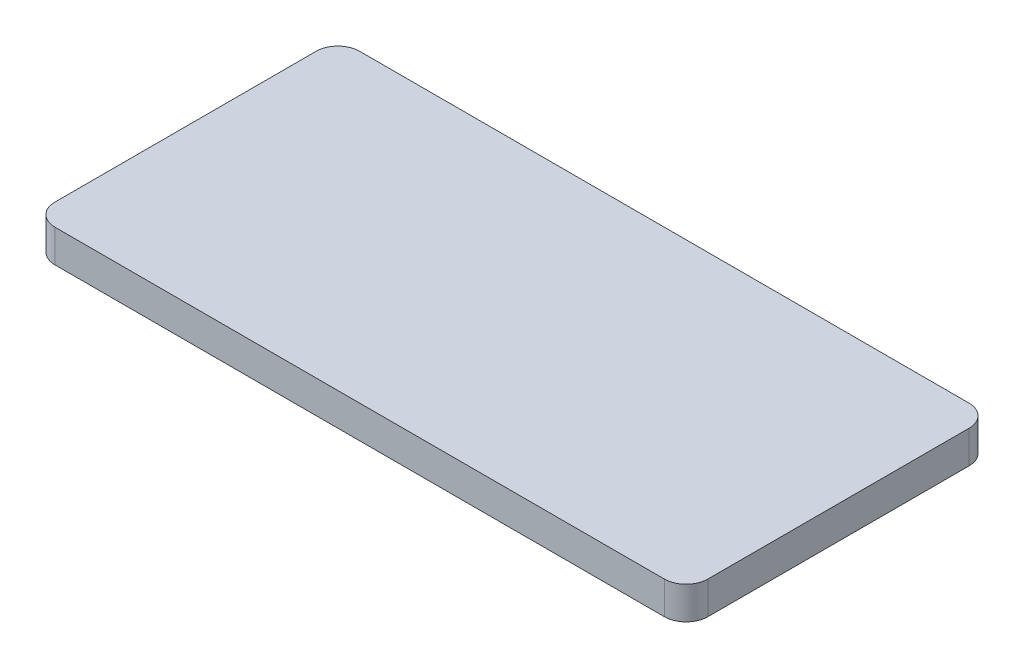
ISO-10303-21;
HEADER;
FILE_DESCRIPTION(('STEP AP214'),'2;1');
FILE_NAME('part.step','',(''),(''),'','','');
FILE_SCHEMA(('AUTOMOTIVE_DESIGN { 1 0 10303 214 1 1 1 1 }'));
ENDSEC;
DATA;
#1=APPLICATION_CONTEXT('core data for automotive mechanical design processes');
#2=APPLICATION_PROTOCOL_DEFINITION('international standard','automotive_design',2000,#1);
#3=PRODUCT_CONTEXT('',#1,'mechanical');
#4=PRODUCT('Part','Part','',(#3));
#5=PRODUCT_RELATED_PRODUCT_CATEGORY('part','',(#4));
#6=PRODUCT_DEFINITION_FORMATION('','',#4);
#7=PRODUCT_DEFINITION_CONTEXT('part definition',#1,'design');
#8=PRODUCT_DEFINITION('design','',#6,#7);
#9=PRODUCT_DEFINITION_SHAPE('','',#8);
#10=(LENGTH_UNIT() NAMED_UNIT(*) SI_UNIT(.MILLI.,.METRE.));
#11=(NAMED_UNIT(*) PLANE_ANGLE_UNIT() SI_UNIT($,.RADIAN.));
#12=(NAMED_UNIT(*) SI_UNIT($,.STERADIAN.) SOLID_ANGLE_UNIT());
#13=UNCERTAINTY_MEASURE_WITH_UNIT(LENGTH_MEASURE(1.E-05),#10,'distance_accuracy_value','');
#14=(GEOMETRIC_REPRESENTATION_CONTEXT(3) GLOBAL_UNCERTAINTY_ASSIGNED_CONTEXT((#13)) GLOBAL_UNIT_ASSIGNED_CONTEXT((#10,
#11,#12)) REPRESENTATION_CONTEXT('',''));
#15=CARTESIAN_POINT('',(0.,0.,0.));
#16=DIRECTION('',(0.,0.,1.));
#17=DIRECTION('',(1.,0.,0.));
#18=AXIS2_PLACEMENT_3D('',#15,#16,#17);
#19=CARTESIAN_POINT('',(343.1275080554,30.,-130.649108067671));
#20=DIRECTION('',(-1.,0.,0.));
#21=DIRECTION('',(0.,0.,1.));
#22=AXIS2_PLACEMENT_3D('',#19,#20,#21);
#23=PLANE('',#22);
#24=DIRECTION('',(0.,0.,-1.));
#25=VECTOR('',#24,1.);
#26=CARTESIAN_POINT('',(343.1275080554,30.,-130.649108067671));
#27=LINE('',#26,#25);
#28=CARTESIAN_POINT('',(343.1275080554,30.,129.350891932329));
#29=VERTEX_POINT('',#28);
#30=CARTESIAN_POINT('',(343.1275080554,30.,-110.649108067671));
#31=VERTEX_POINT('',#30);
#32=EDGE_CURVE('E130',#29,#31,#27,.T.);
#33=ORIENTED_EDGE('',*,*,#32,.F.);
#34=DIRECTION('',(0.,-1.,0.));
#35=VECTOR('',#34,1.);
#36=CARTESIAN_POINT('',(343.1275080554,30.,129.350891932329));
#37=LINE('',#36,#35);
#38=CARTESIAN_POINT('',(343.1275080554,0.,129.350891932329));
#39=VERTEX_POINT('',#38);
#40=EDGE_CURVE('E114',#29,#39,#37,.T.);
#41=ORIENTED_EDGE('',*,*,#40,.T.);
#42=DIRECTION('',(0.,0.,-1.));
#43=VECTOR('',#42,1.);
#44=CARTESIAN_POINT('',(343.1275080554,0.,-130.649108067671));
#45=LINE('',#44,#43);
#46=CARTESIAN_POINT('',(343.1275080554,0.,-110.649108067671));
#47=VERTEX_POINT('',#46);
#48=EDGE_CURVE('E127',#39,#47,#45,.T.);
#49=ORIENTED_EDGE('',*,*,#48,.T.);
#50=DIRECTION('',(0.,-1.,0.));
#51=VECTOR('',#50,1.);
#52=CARTESIAN_POINT('',(343.1275080554,30.,-110.649108067671));
#53=LINE('',#52,#51);
#54=EDGE_CURVE('E133',#47,#31,#53,.F.);
#55=ORIENTED_EDGE('',*,*,#54,.T.);
#56=EDGE_LOOP('',(#33,#41,#49,#55));
#57=FACE_BOUND('',#56,.T.);
#58=ADVANCED_FACE('F43',(#57),#23,.F.);
#59=CARTESIAN_POINT('',(-256.8724919446,30.,-130.649108067671));
#60=DIRECTION('',(0.,0.,1.));
#61=DIRECTION('',(1.,0.,0.));
#62=AXIS2_PLACEMENT_3D('',#59,#60,#61);
#63=PLANE('',#62);
#64=DIRECTION('',(-1.,0.,0.));
#65=VECTOR('',#64,1.);
#66=CARTESIAN_POINT('',(-256.8724919446,30.,-130.649108067671));
#67=LINE('',#66,#65);
#68=CARTESIAN_POINT('',(323.1275080554,30.,-130.649108067671));
#69=VERTEX_POINT('',#68);
#70=CARTESIAN_POINT('',(-236.8724919446,30.,-130.649108067671));
#71=VERTEX_POINT('',#70);
#72=EDGE_CURVE('E190',#69,#71,#67,.T.);
#73=ORIENTED_EDGE('',*,*,#72,.F.);
#74=DIRECTION('',(0.,-1.,0.));
#75=VECTOR('',#74,1.);
#76=CARTESIAN_POINT('',(323.1275080554,30.,-130.649108067671));
#77=LINE('',#76,#75);
#78=CARTESIAN_POINT('',(323.1275080554,0.,-130.649108067671));
#79=VERTEX_POINT('',#78);
#80=EDGE_CURVE('E181',#69,#79,#77,.T.);
#81=ORIENTED_EDGE('',*,*,#80,.T.);
#82=DIRECTION('',(-1.,0.,0.));
#83=VECTOR('',#82,1.);
#84=CARTESIAN_POINT('',(-256.8724919446,0.,-130.649108067671));
#85=LINE('',#84,#83);
#86=CARTESIAN_POINT('',(-236.8724919446,0.,-130.649108067671));
#87=VERTEX_POINT('',#86);
#88=EDGE_CURVE('E138',#79,#87,#85,.T.);
#89=ORIENTED_EDGE('',*,*,#88,.T.);
#90=DIRECTION('',(0.,-1.,0.));
#91=VECTOR('',#90,1.);
#92=CARTESIAN_POINT('',(-236.8724919446,30.,-130.649108067671));
#93=LINE('',#92,#91);
#94=EDGE_CURVE('E178',#87,#71,#93,.F.);
#95=ORIENTED_EDGE('',*,*,#94,.T.);
#96=EDGE_LOOP('',(#73,#81,#89,#95));
#97=FACE_BOUND('',#96,.T.);
#98=ADVANCED_FACE('F201',(#97),#63,.F.);
#99=CARTESIAN_POINT('',(-256.8724919446,30.,-130.649108067671));
#100=DIRECTION('',(1.,0.,0.));
#101=DIRECTION('',(0.,0.,-1.));
#102=AXIS2_PLACEMENT_3D('',#99,#100,#101);
#103=PLANE('',#102);
#104=DIRECTION('',(0.,0.,1.));
#105=VECTOR('',#104,1.);
#106=CARTESIAN_POINT('',(-256.8724919446,30.,-130.649108067671));
#107=LINE('',#106,#105);
#108=CARTESIAN_POINT('',(-256.8724919446,30.,-110.649108067671));
#109=VERTEX_POINT('',#108);
#110=CARTESIAN_POINT('',(-256.8724919446,30.,129.350891932329));
#111=VERTEX_POINT('',#110);
#112=EDGE_CURVE('E188',#109,#111,#107,.T.);
#113=ORIENTED_EDGE('',*,*,#112,.F.);
#114=DIRECTION('',(0.,-1.,0.));
#115=VECTOR('',#114,1.);
#116=CARTESIAN_POINT('',(-256.8724919446,30.,-110.649108067671));
#117=LINE('',#116,#115);
#118=CARTESIAN_POINT('',(-256.8724919446,0.,-110.649108067671));
#119=VERTEX_POINT('',#118);
#120=EDGE_CURVE('E11',#109,#119,#117,.T.);
#121=ORIENTED_EDGE('',*,*,#120,.T.);
#122=DIRECTION('',(0.,0.,1.));
#123=VECTOR('',#122,1.);
#124=CARTESIAN_POINT('',(-256.8724919446,0.,-130.649108067671));
#125=LINE('',#124,#123);
#126=CARTESIAN_POINT('',(-256.8724919446,0.,129.350891932329));
#127=VERTEX_POINT('',#126);
#128=EDGE_CURVE('E142',#119,#127,#125,.T.);
#129=ORIENTED_EDGE('',*,*,#128,.T.);
#130=DIRECTION('',(0.,-1.,0.));
#131=VECTOR('',#130,1.);
#132=CARTESIAN_POINT('',(-256.8724919446,30.,129.350891932329));
#133=LINE('',#132,#131);
#134=EDGE_CURVE('E52',#127,#111,#133,.F.);
#135=ORIENTED_EDGE('',*,*,#134,.T.);
#136=EDGE_LOOP('',(#113,#121,#129,#135));
#137=FACE_BOUND('',#136,.T.);
#138=ADVANCED_FACE('F207',(#137),#103,.F.);
#139=CARTESIAN_POINT('',(-256.8724919446,30.,149.350891932329));
#140=DIRECTION('',(0.,0.,-1.));
#141=DIRECTION('',(-1.,0.,0.));
#142=AXIS2_PLACEMENT_3D('',#139,#140,#141);
#143=PLANE('',#142);
#144=DIRECTION('',(1.,0.,0.));
#145=VECTOR('',#144,1.);
#146=CARTESIAN_POINT('',(-256.8724919446,0.,149.350891932329));
#147=LINE('',#146,#145);
#148=CARTESIAN_POINT('',(-236.8724919446,0.,149.350891932329));
#149=VERTEX_POINT('',#148);
#150=CARTESIAN_POINT('',(323.1275080554,0.,149.350891932329));
#151=VERTEX_POINT('',#150);
#152=EDGE_CURVE('E150',#149,#151,#147,.T.);
#153=ORIENTED_EDGE('',*,*,#152,.T.);
#154=DIRECTION('',(0.,-1.,0.));
#155=VECTOR('',#154,1.);
#156=CARTESIAN_POINT('',(323.1275080554,30.,149.350891932329));
#157=LINE('',#156,#155);
#158=CARTESIAN_POINT('',(323.1275080554,30.,149.350891932329));
#159=VERTEX_POINT('',#158);
#160=EDGE_CURVE('E115',#151,#159,#157,.F.);
#161=ORIENTED_EDGE('',*,*,#160,.T.);
#162=DIRECTION('',(1.,0.,0.));
#163=VECTOR('',#162,1.);
#164=CARTESIAN_POINT('',(-256.8724919446,30.,149.350891932329));
#165=LINE('',#164,#163);
#166=CARTESIAN_POINT('',(-236.8724919446,30.,149.350891932329));
#167=VERTEX_POINT('',#166);
#168=EDGE_CURVE('E145',#167,#159,#165,.T.);
#169=ORIENTED_EDGE('',*,*,#168,.F.);
#170=DIRECTION('',(0.,-1.,0.));
#171=VECTOR('',#170,1.);
#172=CARTESIAN_POINT('',(-236.8724919446,30.,149.350891932329));
#173=LINE('',#172,#171);
#174=EDGE_CURVE('E121',#167,#149,#173,.T.);
#175=ORIENTED_EDGE('',*,*,#174,.T.);
#176=EDGE_LOOP('',(#153,#161,#169,#175));
#177=FACE_BOUND('',#176,.T.);
#178=ADVANCED_FACE('F213',(#177),#143,.F.);
#179=CARTESIAN_POINT('',(0.,30.,0.));
#180=DIRECTION('',(0.,1.,0.));
#181=DIRECTION('',(0.,0.,1.));
#182=AXIS2_PLACEMENT_3D('',#179,#180,#181);
#183=PLANE('',#182);
#184=ORIENTED_EDGE('',*,*,#168,.T.);
#185=CARTESIAN_POINT('',(323.1275080554,30.,129.350891932329));
#186=DIRECTION('',(0.,1.,0.));
#187=DIRECTION('',(0.,0.,1.));
#188=AXIS2_PLACEMENT_3D('',#185,#186,#187);
#189=CIRCLE('',#188,20.);
#190=EDGE_CURVE('E175',#159,#29,#189,.T.);
#191=ORIENTED_EDGE('',*,*,#190,.T.);
#192=ORIENTED_EDGE('',*,*,#32,.T.);
#193=CARTESIAN_POINT('',(323.1275080554,30.,-110.649108067671));
#194=DIRECTION('',(0.,1.,0.));
#195=DIRECTION('',(0.,0.,1.));
#196=AXIS2_PLACEMENT_3D('',#193,#194,#195);
#197=CIRCLE('',#196,20.);
#198=EDGE_CURVE('E172',#31,#69,#197,.T.);
#199=ORIENTED_EDGE('',*,*,#198,.T.);
#200=ORIENTED_EDGE('',*,*,#72,.T.);
#201=CARTESIAN_POINT('',(-236.8724919446,30.,-110.649108067671));
#202=DIRECTION('',(0.,1.,0.));
#203=DIRECTION('',(0.,0.,1.));
#204=AXIS2_PLACEMENT_3D('',#201,#202,#203);
#205=CIRCLE('',#204,20.);
#206=EDGE_CURVE('E65',#71,#109,#205,.T.);
#207=ORIENTED_EDGE('',*,*,#206,.T.);
#208=ORIENTED_EDGE('',*,*,#112,.T.);
#209=CARTESIAN_POINT('',(-236.8724919446,30.,129.350891932329));
#210=DIRECTION('',(0.,1.,0.));
#211=DIRECTION('',(0.,0.,1.));
#212=AXIS2_PLACEMENT_3D('',#209,#210,#211);
#213=CIRCLE('',#212,20.);
#214=EDGE_CURVE('E167',#111,#167,#213,.T.);
#215=ORIENTED_EDGE('',*,*,#214,.T.);
#216=EDGE_LOOP('',(#184,#191,#192,#199,#200,#207,#208,#215));
#217=FACE_BOUND('',#216,.T.);
#218=ADVANCED_FACE('F195',(#217),#183,.T.);
#219=CARTESIAN_POINT('',(0.,0.,0.));
#220=DIRECTION('',(0.,1.,0.));
#221=DIRECTION('',(0.,0.,1.));
#222=AXIS2_PLACEMENT_3D('',#219,#220,#221);
#223=PLANE('',#222);
#224=ORIENTED_EDGE('',*,*,#48,.F.);
#225=CARTESIAN_POINT('',(323.1275080554,0.,129.350891932329));
#226=DIRECTION('',(0.,1.,0.));
#227=DIRECTION('',(0.,0.,1.));
#228=AXIS2_PLACEMENT_3D('',#225,#226,#227);
#229=CIRCLE('',#228,20.);
#230=EDGE_CURVE('E110',#39,#151,#229,.F.);
#231=ORIENTED_EDGE('',*,*,#230,.T.);
#232=ORIENTED_EDGE('',*,*,#152,.F.);
#233=CARTESIAN_POINT('',(-236.8724919446,0.,129.350891932329));
#234=DIRECTION('',(0.,1.,0.));
#235=DIRECTION('',(0.,0.,1.));
#236=AXIS2_PLACEMENT_3D('',#233,#234,#235);
#237=CIRCLE('',#236,20.);
#238=EDGE_CURVE('E132',#149,#127,#237,.F.);
#239=ORIENTED_EDGE('',*,*,#238,.T.);
#240=ORIENTED_EDGE('',*,*,#128,.F.);
#241=CARTESIAN_POINT('',(-236.8724919446,0.,-110.649108067671));
#242=DIRECTION('',(0.,1.,0.));
#243=DIRECTION('',(0.,0.,1.));
#244=AXIS2_PLACEMENT_3D('',#241,#242,#243);
#245=CIRCLE('',#244,20.);
#246=EDGE_CURVE('E157',#119,#87,#245,.F.);
#247=ORIENTED_EDGE('',*,*,#246,.T.);
#248=ORIENTED_EDGE('',*,*,#88,.F.);
#249=CARTESIAN_POINT('',(323.1275080554,0.,-110.649108067671));
#250=DIRECTION('',(0.,1.,0.));
#251=DIRECTION('',(0.,0.,1.));
#252=AXIS2_PLACEMENT_3D('',#249,#250,#251);
#253=CIRCLE('',#252,20.);
#254=EDGE_CURVE('E122',#79,#47,#253,.F.);
#255=ORIENTED_EDGE('',*,*,#254,.T.);
#256=EDGE_LOOP('',(#224,#231,#232,#239,#240,#247,#248,#255));
#257=FACE_BOUND('',#256,.T.);
#258=ADVANCED_FACE('F135',(#257),#223,.F.);
#259=CARTESIAN_POINT('',(323.1275080554,30.,129.350891932329));
#260=DIRECTION('',(0.,-1.,0.));
#261=DIRECTION('',(0.,0.,-1.));
#262=AXIS2_PLACEMENT_3D('',#259,#260,#261);
#263=CYLINDRICAL_SURFACE('',#262,20.);
#264=ORIENTED_EDGE('',*,*,#190,.F.);
#265=ORIENTED_EDGE('',*,*,#160,.F.);
#266=ORIENTED_EDGE('',*,*,#230,.F.);
#267=ORIENTED_EDGE('',*,*,#40,.F.);
#268=EDGE_LOOP('',(#264,#265,#266,#267));
#269=FACE_BOUND('',#268,.T.);
#270=ADVANCED_FACE('F113',(#269),#263,.T.);
#271=CARTESIAN_POINT('',(323.1275080554,30.,-110.649108067671));
#272=DIRECTION('',(0.,-1.,0.));
#273=DIRECTION('',(0.,0.,-1.));
#274=AXIS2_PLACEMENT_3D('',#271,#272,#273);
#275=CYLINDRICAL_SURFACE('',#274,20.);
#276=ORIENTED_EDGE('',*,*,#198,.F.);
#277=ORIENTED_EDGE('',*,*,#54,.F.);
#278=ORIENTED_EDGE('',*,*,#254,.F.);
#279=ORIENTED_EDGE('',*,*,#80,.F.);
#280=EDGE_LOOP('',(#276,#277,#278,#279));
#281=FACE_BOUND('',#280,.T.);
#282=ADVANCED_FACE('F199',(#281),#275,.T.);
#283=CARTESIAN_POINT('',(-236.8724919446,30.,-110.649108067671));
#284=DIRECTION('',(0.,-1.,0.));
#285=DIRECTION('',(0.,0.,-1.));
#286=AXIS2_PLACEMENT_3D('',#283,#284,#285);
#287=CYLINDRICAL_SURFACE('',#286,20.);
#288=ORIENTED_EDGE('',*,*,#206,.F.);
#289=ORIENTED_EDGE('',*,*,#94,.F.);
#290=ORIENTED_EDGE('',*,*,#246,.F.);
#291=ORIENTED_EDGE('',*,*,#120,.F.);
#292=EDGE_LOOP('',(#288,#289,#290,#291));
#293=FACE_BOUND('',#292,.T.);
#294=ADVANCED_FACE('F206',(#293),#287,.T.);
#295=CARTESIAN_POINT('',(-236.8724919446,30.,129.350891932329));
#296=DIRECTION('',(0.,-1.,0.));
#297=DIRECTION('',(0.,0.,-1.));
#298=AXIS2_PLACEMENT_3D('',#295,#296,#297);
#299=CYLINDRICAL_SURFACE('',#298,20.);
#300=ORIENTED_EDGE('',*,*,#214,.F.);
#301=ORIENTED_EDGE('',*,*,#134,.F.);
#302=ORIENTED_EDGE('',*,*,#238,.F.);
#303=ORIENTED_EDGE('',*,*,#174,.F.);
#304=EDGE_LOOP('',(#300,#301,#302,#303));
#305=FACE_BOUND('',#304,.T.);
#306=ADVANCED_FACE('F45',(#305),#299,.T.);
#307=CLOSED_SHELL('',(#58,#98,#138,#178,#218,#258,#270,#282,#294,#306));
#308=MANIFOLD_SOLID_BREP('B2',#307);
#309=ADVANCED_BREP_SHAPE_REPRESENTATION('',(#18,#308),#14);
#310=SHAPE_DEFINITION_REPRESENTATION(#9,#309);
ENDSEC;
END-ISO-10303-21;
